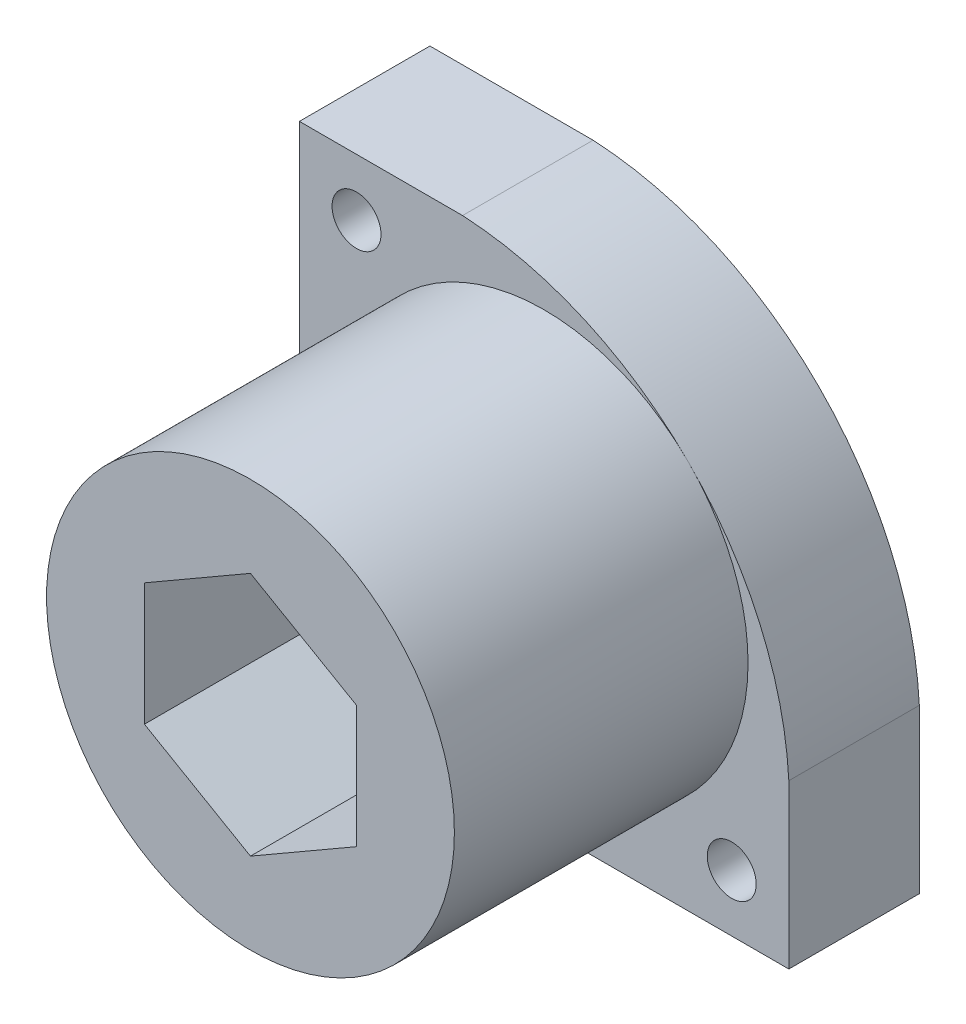
ISO-10303-21;
HEADER;
FILE_DESCRIPTION(('STEP AP214'),'2;1');
FILE_NAME('part.step','',(''),(''),'','','');
FILE_SCHEMA(('AUTOMOTIVE_DESIGN { 1 0 10303 214 1 1 1 1 }'));
ENDSEC;
DATA;
#1=APPLICATION_CONTEXT('core data for automotive mechanical design processes');
#2=APPLICATION_PROTOCOL_DEFINITION('international standard','automotive_design',2000,#1);
#3=PRODUCT_CONTEXT('',#1,'mechanical');
#4=PRODUCT('Part','Part','',(#3));
#5=PRODUCT_RELATED_PRODUCT_CATEGORY('part','',(#4));
#6=PRODUCT_DEFINITION_FORMATION('','',#4);
#7=PRODUCT_DEFINITION_CONTEXT('part definition',#1,'design');
#8=PRODUCT_DEFINITION('design','',#6,#7);
#9=PRODUCT_DEFINITION_SHAPE('','',#8);
#10=(LENGTH_UNIT() NAMED_UNIT(*) SI_UNIT(.MILLI.,.METRE.));
#11=(NAMED_UNIT(*) PLANE_ANGLE_UNIT() SI_UNIT($,.RADIAN.));
#12=(NAMED_UNIT(*) SI_UNIT($,.STERADIAN.) SOLID_ANGLE_UNIT());
#13=UNCERTAINTY_MEASURE_WITH_UNIT(LENGTH_MEASURE(1.E-05),#10,'distance_accuracy_value','');
#14=(GEOMETRIC_REPRESENTATION_CONTEXT(3) GLOBAL_UNCERTAINTY_ASSIGNED_CONTEXT((#13)) GLOBAL_UNIT_ASSIGNED_CONTEXT((#10,
#11,#12)) REPRESENTATION_CONTEXT('',''));
#15=CARTESIAN_POINT('',(0.,0.,0.));
#16=DIRECTION('',(0.,0.,1.));
#17=DIRECTION('',(1.,0.,0.));
#18=AXIS2_PLACEMENT_3D('',#15,#16,#17);
#19=CARTESIAN_POINT('',(0.,0.,8.));
#20=DIRECTION('',(0.,0.,-1.));
#21=DIRECTION('',(-1.,0.,0.));
#22=AXIS2_PLACEMENT_3D('',#19,#20,#21);
#23=PLANE('',#22);
#24=CARTESIAN_POINT('',(26.5,3.5,8.));
#25=DIRECTION('',(0.,0.,1.));
#26=DIRECTION('',(1.,0.,0.));
#27=AXIS2_PLACEMENT_3D('',#24,#25,#26);
#28=CIRCLE('',#27,1.5);
#29=CARTESIAN_POINT('',(28.,3.5,8.));
#30=VERTEX_POINT('',#29);
#31=EDGE_CURVE('E225',#30,#30,#28,.T.);
#32=ORIENTED_EDGE('',*,*,#31,.F.);
#33=EDGE_LOOP('',(#32));
#34=FACE_BOUND('',#33,.T.);
#35=CARTESIAN_POINT('',(3.49999999999999,3.5,8.));
#36=DIRECTION('',(0.,0.,1.));
#37=DIRECTION('',(1.,0.,0.));
#38=AXIS2_PLACEMENT_3D('',#35,#36,#37);
#39=CIRCLE('',#38,1.5);
#40=CARTESIAN_POINT('',(4.99999999999999,3.5,8.));
#41=VERTEX_POINT('',#40);
#42=EDGE_CURVE('E218',#41,#41,#39,.T.);
#43=ORIENTED_EDGE('',*,*,#42,.F.);
#44=EDGE_LOOP('',(#43));
#45=FACE_BOUND('',#44,.T.);
#46=CARTESIAN_POINT('',(3.49999999999999,26.5,8.));
#47=DIRECTION('',(0.,0.,1.));
#48=DIRECTION('',(1.,0.,0.));
#49=AXIS2_PLACEMENT_3D('',#46,#47,#48);
#50=CIRCLE('',#49,1.5);
#51=CARTESIAN_POINT('',(4.99999999999999,26.5,8.));
#52=VERTEX_POINT('',#51);
#53=EDGE_CURVE('E212',#52,#52,#50,.T.);
#54=ORIENTED_EDGE('',*,*,#53,.F.);
#55=EDGE_LOOP('',(#54));
#56=FACE_BOUND('',#55,.T.);
#57=DIRECTION('',(0.,1.,0.));
#58=VECTOR('',#57,1.);
#59=CARTESIAN_POINT('',(30.,0.,8.));
#60=LINE('',#59,#58);
#61=CARTESIAN_POINT('',(30.,0.,8.));
#62=VERTEX_POINT('',#61);
#63=CARTESIAN_POINT('',(30.,10.,8.));
#64=VERTEX_POINT('',#63);
#65=EDGE_CURVE('E131',#62,#64,#60,.T.);
#66=ORIENTED_EDGE('',*,*,#65,.T.);
#67=CARTESIAN_POINT('',(8.89463172139773,8.89463172139773,8.));
#68=DIRECTION('',(0.,0.,-1.));
#69=DIRECTION('',(-1.,0.,0.));
#70=AXIS2_PLACEMENT_3D('',#67,#68,#69);
#71=CIRCLE('',#70,21.1342946228818);
#72=CARTESIAN_POINT('',(23.8388347648318,23.8388347648319,8.));
#73=VERTEX_POINT('',#72);
#74=EDGE_CURVE('E117',#73,#64,#71,.T.);
#75=ORIENTED_EDGE('',*,*,#74,.F.);
#76=CARTESIAN_POINT('',(15.,15.,8.));
#77=DIRECTION('',(0.,0.,-1.));
#78=DIRECTION('',(-1.,0.,0.));
#79=AXIS2_PLACEMENT_3D('',#76,#77,#78);
#80=CIRCLE('',#79,12.5);
#81=EDGE_CURVE('E41',#73,#73,#80,.F.);
#82=ORIENTED_EDGE('',*,*,#81,.F.);
#83=CARTESIAN_POINT('',(9.99999999999999,30.,8.));
#84=VERTEX_POINT('',#83);
#85=EDGE_CURVE('E120',#84,#73,#71,.T.);
#86=ORIENTED_EDGE('',*,*,#85,.F.);
#87=DIRECTION('',(-1.,0.,0.));
#88=VECTOR('',#87,1.);
#89=CARTESIAN_POINT('',(0.,30.,8.));
#90=LINE('',#89,#88);
#91=CARTESIAN_POINT('',(0.,30.,8.));
#92=VERTEX_POINT('',#91);
#93=EDGE_CURVE('E139',#84,#92,#90,.T.);
#94=ORIENTED_EDGE('',*,*,#93,.T.);
#95=DIRECTION('',(0.,-1.,0.));
#96=VECTOR('',#95,1.);
#97=CARTESIAN_POINT('',(0.,0.,8.));
#98=LINE('',#97,#96);
#99=CARTESIAN_POINT('',(0.,0.,8.));
#100=VERTEX_POINT('',#99);
#101=EDGE_CURVE('E143',#92,#100,#98,.T.);
#102=ORIENTED_EDGE('',*,*,#101,.T.);
#103=DIRECTION('',(1.,0.,0.));
#104=VECTOR('',#103,1.);
#105=CARTESIAN_POINT('',(0.,0.,8.));
#106=LINE('',#105,#104);
#107=EDGE_CURVE('E137',#100,#62,#106,.T.);
#108=ORIENTED_EDGE('',*,*,#107,.T.);
#109=EDGE_LOOP('',(#66,#75,#82,#86,#94,#102,#108));
#110=FACE_BOUND('',#109,.T.);
#111=ADVANCED_FACE('F33',(#34,#45,#56,#110),#23,.F.);
#112=CARTESIAN_POINT('',(0.,0.,8.));
#113=DIRECTION('',(1.,0.,0.));
#114=DIRECTION('',(0.,1.,0.));
#115=AXIS2_PLACEMENT_3D('',#112,#113,#114);
#116=PLANE('',#115);
#117=DIRECTION('',(0.,-1.,0.));
#118=VECTOR('',#117,1.);
#119=CARTESIAN_POINT('',(0.,0.,0.));
#120=LINE('',#119,#118);
#121=CARTESIAN_POINT('',(0.,30.,0.));
#122=VERTEX_POINT('',#121);
#123=CARTESIAN_POINT('',(0.,0.,0.));
#124=VERTEX_POINT('',#123);
#125=EDGE_CURVE('E147',#122,#124,#120,.T.);
#126=ORIENTED_EDGE('',*,*,#125,.T.);
#127=DIRECTION('',(0.,0.,-1.));
#128=VECTOR('',#127,1.);
#129=CARTESIAN_POINT('',(0.,0.,8.));
#130=LINE('',#129,#128);
#131=EDGE_CURVE('E160',#100,#124,#130,.T.);
#132=ORIENTED_EDGE('',*,*,#131,.F.);
#133=ORIENTED_EDGE('',*,*,#101,.F.);
#134=DIRECTION('',(0.,0.,-1.));
#135=VECTOR('',#134,1.);
#136=CARTESIAN_POINT('',(0.,30.,8.));
#137=LINE('',#136,#135);
#138=EDGE_CURVE('E141',#92,#122,#137,.T.);
#139=ORIENTED_EDGE('',*,*,#138,.T.);
#140=EDGE_LOOP('',(#126,#132,#133,#139));
#141=FACE_BOUND('',#140,.T.);
#142=ADVANCED_FACE('F35',(#141),#116,.F.);
#143=CARTESIAN_POINT('',(0.,0.,8.));
#144=DIRECTION('',(0.,1.,0.));
#145=DIRECTION('',(0.,0.,1.));
#146=AXIS2_PLACEMENT_3D('',#143,#144,#145);
#147=PLANE('',#146);
#148=DIRECTION('',(1.,0.,0.));
#149=VECTOR('',#148,1.);
#150=CARTESIAN_POINT('',(0.,0.,0.));
#151=LINE('',#150,#149);
#152=CARTESIAN_POINT('',(30.,0.,0.));
#153=VERTEX_POINT('',#152);
#154=EDGE_CURVE('E150',#124,#153,#151,.T.);
#155=ORIENTED_EDGE('',*,*,#154,.T.);
#156=DIRECTION('',(0.,0.,-1.));
#157=VECTOR('',#156,1.);
#158=CARTESIAN_POINT('',(30.,0.,8.));
#159=LINE('',#158,#157);
#160=EDGE_CURVE('E158',#62,#153,#159,.T.);
#161=ORIENTED_EDGE('',*,*,#160,.F.);
#162=ORIENTED_EDGE('',*,*,#107,.F.);
#163=ORIENTED_EDGE('',*,*,#131,.T.);
#164=EDGE_LOOP('',(#155,#161,#162,#163));
#165=FACE_BOUND('',#164,.T.);
#166=ADVANCED_FACE('F253',(#165),#147,.F.);
#167=CARTESIAN_POINT('',(30.,0.,8.));
#168=DIRECTION('',(-1.,0.,0.));
#169=DIRECTION('',(0.,-1.,0.));
#170=AXIS2_PLACEMENT_3D('',#167,#168,#169);
#171=PLANE('',#170);
#172=DIRECTION('',(0.,1.,0.));
#173=VECTOR('',#172,1.);
#174=CARTESIAN_POINT('',(30.,0.,0.));
#175=LINE('',#174,#173);
#176=CARTESIAN_POINT('',(30.,10.,0.));
#177=VERTEX_POINT('',#176);
#178=EDGE_CURVE('E133',#153,#177,#175,.T.);
#179=ORIENTED_EDGE('',*,*,#178,.T.);
#180=DIRECTION('',(0.,0.,1.));
#181=VECTOR('',#180,1.);
#182=CARTESIAN_POINT('',(30.,10.,-2.));
#183=LINE('',#182,#181);
#184=EDGE_CURVE('E47',#177,#64,#183,.T.);
#185=ORIENTED_EDGE('',*,*,#184,.T.);
#186=ORIENTED_EDGE('',*,*,#65,.F.);
#187=ORIENTED_EDGE('',*,*,#160,.T.);
#188=EDGE_LOOP('',(#179,#185,#186,#187));
#189=FACE_BOUND('',#188,.T.);
#190=ADVANCED_FACE('F129',(#189),#171,.F.);
#191=CARTESIAN_POINT('',(0.,30.,8.));
#192=DIRECTION('',(0.,-1.,0.));
#193=DIRECTION('',(0.,0.,-1.));
#194=AXIS2_PLACEMENT_3D('',#191,#192,#193);
#195=PLANE('',#194);
#196=ORIENTED_EDGE('',*,*,#93,.F.);
#197=DIRECTION('',(0.,0.,1.));
#198=VECTOR('',#197,1.);
#199=CARTESIAN_POINT('',(9.99999999999999,30.,-2.));
#200=LINE('',#199,#198);
#201=CARTESIAN_POINT('',(9.99999999999999,30.,0.));
#202=VERTEX_POINT('',#201);
#203=EDGE_CURVE('E134',#202,#84,#200,.T.);
#204=ORIENTED_EDGE('',*,*,#203,.F.);
#205=DIRECTION('',(-1.,0.,0.));
#206=VECTOR('',#205,1.);
#207=CARTESIAN_POINT('',(0.,30.,0.));
#208=LINE('',#207,#206);
#209=EDGE_CURVE('E154',#202,#122,#208,.T.);
#210=ORIENTED_EDGE('',*,*,#209,.T.);
#211=ORIENTED_EDGE('',*,*,#138,.F.);
#212=EDGE_LOOP('',(#196,#204,#210,#211));
#213=FACE_BOUND('',#212,.T.);
#214=ADVANCED_FACE('F169',(#213),#195,.F.);
#215=CARTESIAN_POINT('',(0.,0.,0.));
#216=DIRECTION('',(0.,0.,-1.));
#217=DIRECTION('',(-1.,0.,0.));
#218=AXIS2_PLACEMENT_3D('',#215,#216,#217);
#219=PLANE('',#218);
#220=CARTESIAN_POINT('',(8.89463172139773,8.89463172139773,0.));
#221=DIRECTION('',(0.,0.,-1.));
#222=DIRECTION('',(-1.,0.,0.));
#223=AXIS2_PLACEMENT_3D('',#220,#221,#222);
#224=CIRCLE('',#223,21.1342946228818);
#225=EDGE_CURVE('E11',#177,#202,#224,.F.);
#226=ORIENTED_EDGE('',*,*,#225,.F.);
#227=ORIENTED_EDGE('',*,*,#178,.F.);
#228=ORIENTED_EDGE('',*,*,#154,.F.);
#229=ORIENTED_EDGE('',*,*,#125,.F.);
#230=ORIENTED_EDGE('',*,*,#209,.F.);
#231=EDGE_LOOP('',(#226,#227,#228,#229,#230));
#232=FACE_BOUND('',#231,.T.);
#233=CARTESIAN_POINT('',(26.5,3.5,0.));
#234=DIRECTION('',(0.,0.,1.));
#235=DIRECTION('',(1.,0.,0.));
#236=AXIS2_PLACEMENT_3D('',#233,#234,#235);
#237=CIRCLE('',#236,1.5);
#238=CARTESIAN_POINT('',(28.,3.5,0.));
#239=VERTEX_POINT('',#238);
#240=EDGE_CURVE('E215',#239,#239,#237,.T.);
#241=ORIENTED_EDGE('',*,*,#240,.T.);
#242=EDGE_LOOP('',(#241));
#243=FACE_BOUND('',#242,.T.);
#244=CARTESIAN_POINT('',(3.49999999999999,3.5,0.));
#245=DIRECTION('',(0.,0.,1.));
#246=DIRECTION('',(1.,0.,0.));
#247=AXIS2_PLACEMENT_3D('',#244,#245,#246);
#248=CIRCLE('',#247,1.5);
#249=CARTESIAN_POINT('',(4.99999999999999,3.5,0.));
#250=VERTEX_POINT('',#249);
#251=EDGE_CURVE('E221',#250,#250,#248,.T.);
#252=ORIENTED_EDGE('',*,*,#251,.T.);
#253=EDGE_LOOP('',(#252));
#254=FACE_BOUND('',#253,.T.);
#255=CARTESIAN_POINT('',(3.49999999999999,26.5,0.));
#256=DIRECTION('',(0.,0.,1.));
#257=DIRECTION('',(1.,0.,0.));
#258=AXIS2_PLACEMENT_3D('',#255,#256,#257);
#259=CIRCLE('',#258,1.5);
#260=CARTESIAN_POINT('',(4.99999999999999,26.5,0.));
#261=VERTEX_POINT('',#260);
#262=EDGE_CURVE('E209',#261,#261,#259,.T.);
#263=ORIENTED_EDGE('',*,*,#262,.T.);
#264=EDGE_LOOP('',(#263));
#265=FACE_BOUND('',#264,.T.);
#266=CARTESIAN_POINT('',(15.,15.,0.));
#267=DIRECTION('',(0.,0.,1.));
#268=DIRECTION('',(1.,0.,0.));
#269=AXIS2_PLACEMENT_3D('',#266,#267,#268);
#270=CIRCLE('',#269,5.5);
#271=CARTESIAN_POINT('',(20.5,15.,0.));
#272=VERTEX_POINT('',#271);
#273=EDGE_CURVE('E205',#272,#272,#270,.T.);
#274=ORIENTED_EDGE('',*,*,#273,.T.);
#275=EDGE_LOOP('',(#274));
#276=FACE_BOUND('',#275,.T.);
#277=ADVANCED_FACE('F250',(#232,#243,#254,#265,#276),#219,.T.);
#278=CARTESIAN_POINT('',(15.,15.,16.));
#279=DIRECTION('',(0.,0.,-1.));
#280=DIRECTION('',(-1.,0.,0.));
#281=AXIS2_PLACEMENT_3D('',#278,#279,#280);
#282=CYLINDRICAL_SURFACE('',#281,12.5);
#283=ORIENTED_EDGE('',*,*,#81,.T.);
#284=EDGE_LOOP('',(#283));
#285=FACE_BOUND('',#284,.T.);
#286=CARTESIAN_POINT('',(15.,15.,26.));
#287=DIRECTION('',(0.,0.,1.));
#288=DIRECTION('',(1.,0.,0.));
#289=AXIS2_PLACEMENT_3D('',#286,#287,#288);
#290=CIRCLE('',#289,12.5);
#291=CARTESIAN_POINT('',(27.5,15.,26.));
#292=VERTEX_POINT('',#291);
#293=EDGE_CURVE('E222',#292,#292,#290,.T.);
#294=ORIENTED_EDGE('',*,*,#293,.F.);
#295=EDGE_LOOP('',(#294));
#296=FACE_BOUND('',#295,.T.);
#297=ADVANCED_FACE('F163',(#285,#296),#282,.T.);
#298=CARTESIAN_POINT('',(21.5,18.7527767497326,16.));
#299=DIRECTION('',(-0.5,-0.866025403784439,0.));
#300=DIRECTION('',(0.866025403784439,-0.5,0.));
#301=AXIS2_PLACEMENT_3D('',#298,#299,#300);
#302=PLANE('',#301);
#303=DIRECTION('',(-0.866025403784438,0.5,0.));
#304=VECTOR('',#303,1.);
#305=CARTESIAN_POINT('',(21.5,18.7527767497326,8.));
#306=LINE('',#305,#304);
#307=CARTESIAN_POINT('',(21.5,18.7527767497326,8.));
#308=VERTEX_POINT('',#307);
#309=CARTESIAN_POINT('',(15.,22.5055534994651,8.));
#310=VERTEX_POINT('',#309);
#311=EDGE_CURVE('E202',#308,#310,#306,.T.);
#312=ORIENTED_EDGE('',*,*,#311,.F.);
#313=DIRECTION('',(0.,0.,-1.));
#314=VECTOR('',#313,1.);
#315=CARTESIAN_POINT('',(21.5,18.7527767497326,16.));
#316=LINE('',#315,#314);
#317=CARTESIAN_POINT('',(21.5,18.7527767497326,26.));
#318=VERTEX_POINT('',#317);
#319=EDGE_CURVE('E55',#318,#308,#316,.T.);
#320=ORIENTED_EDGE('',*,*,#319,.F.);
#321=DIRECTION('',(-0.866025403784438,0.5,0.));
#322=VECTOR('',#321,1.);
#323=CARTESIAN_POINT('',(21.5,18.7527767497326,26.));
#324=LINE('',#323,#322);
#325=CARTESIAN_POINT('',(15.,22.5055534994651,26.));
#326=VERTEX_POINT('',#325);
#327=EDGE_CURVE('E246',#318,#326,#324,.T.);
#328=ORIENTED_EDGE('',*,*,#327,.T.);
#329=DIRECTION('',(0.,0.,-1.));
#330=VECTOR('',#329,1.);
#331=CARTESIAN_POINT('',(15.,22.5055534994651,16.));
#332=LINE('',#331,#330);
#333=EDGE_CURVE('E151',#326,#310,#332,.T.);
#334=ORIENTED_EDGE('',*,*,#333,.T.);
#335=EDGE_LOOP('',(#312,#320,#328,#334));
#336=FACE_BOUND('',#335,.T.);
#337=ADVANCED_FACE('F298',(#336),#302,.T.);
#338=CARTESIAN_POINT('',(15.,22.5055534994651,16.));
#339=DIRECTION('',(0.5,-0.866025403784439,0.));
#340=DIRECTION('',(0.866025403784439,0.5,0.));
#341=AXIS2_PLACEMENT_3D('',#338,#339,#340);
#342=PLANE('',#341);
#343=DIRECTION('',(-0.866025403784438,-0.5,0.));
#344=VECTOR('',#343,1.);
#345=CARTESIAN_POINT('',(15.,22.5055534994651,8.));
#346=LINE('',#345,#344);
#347=CARTESIAN_POINT('',(8.49999999999999,18.7527767497326,8.));
#348=VERTEX_POINT('',#347);
#349=EDGE_CURVE('E199',#310,#348,#346,.T.);
#350=ORIENTED_EDGE('',*,*,#349,.F.);
#351=ORIENTED_EDGE('',*,*,#333,.F.);
#352=DIRECTION('',(-0.866025403784439,-0.5,0.));
#353=VECTOR('',#352,1.);
#354=CARTESIAN_POINT('',(15.,22.5055534994651,26.));
#355=LINE('',#354,#353);
#356=CARTESIAN_POINT('',(8.49999999999999,18.7527767497326,26.));
#357=VERTEX_POINT('',#356);
#358=EDGE_CURVE('E243',#326,#357,#355,.T.);
#359=ORIENTED_EDGE('',*,*,#358,.T.);
#360=DIRECTION('',(0.,0.,-1.));
#361=VECTOR('',#360,1.);
#362=CARTESIAN_POINT('',(8.49999999999999,18.7527767497326,16.));
#363=LINE('',#362,#361);
#364=EDGE_CURVE('E178',#357,#348,#363,.T.);
#365=ORIENTED_EDGE('',*,*,#364,.T.);
#366=EDGE_LOOP('',(#350,#351,#359,#365));
#367=FACE_BOUND('',#366,.T.);
#368=ADVANCED_FACE('F300',(#367),#342,.T.);
#369=CARTESIAN_POINT('',(8.49999999999999,18.7527767497326,16.));
#370=DIRECTION('',(1.,0.,0.));
#371=DIRECTION('',(0.,0.,-1.));
#372=AXIS2_PLACEMENT_3D('',#369,#370,#371);
#373=PLANE('',#372);
#374=DIRECTION('',(0.,-1.,0.));
#375=VECTOR('',#374,1.);
#376=CARTESIAN_POINT('',(8.49999999999999,18.7527767497326,8.));
#377=LINE('',#376,#375);
#378=CARTESIAN_POINT('',(8.49999999999999,11.2472232502674,8.));
#379=VERTEX_POINT('',#378);
#380=EDGE_CURVE('E196',#348,#379,#377,.T.);
#381=ORIENTED_EDGE('',*,*,#380,.F.);
#382=ORIENTED_EDGE('',*,*,#364,.F.);
#383=DIRECTION('',(0.,-1.,0.));
#384=VECTOR('',#383,1.);
#385=CARTESIAN_POINT('',(8.49999999999999,18.7527767497326,26.));
#386=LINE('',#385,#384);
#387=CARTESIAN_POINT('',(8.49999999999999,11.2472232502674,26.));
#388=VERTEX_POINT('',#387);
#389=EDGE_CURVE('E240',#357,#388,#386,.T.);
#390=ORIENTED_EDGE('',*,*,#389,.T.);
#391=DIRECTION('',(0.,0.,-1.));
#392=VECTOR('',#391,1.);
#393=CARTESIAN_POINT('',(8.49999999999999,11.2472232502674,16.));
#394=LINE('',#393,#392);
#395=EDGE_CURVE('E180',#388,#379,#394,.T.);
#396=ORIENTED_EDGE('',*,*,#395,.T.);
#397=EDGE_LOOP('',(#381,#382,#390,#396));
#398=FACE_BOUND('',#397,.T.);
#399=ADVANCED_FACE('F304',(#398),#373,.T.);
#400=CARTESIAN_POINT('',(8.49999999999999,11.2472232502674,16.));
#401=DIRECTION('',(0.5,0.866025403784439,0.));
#402=DIRECTION('',(-0.866025403784439,0.5,0.));
#403=AXIS2_PLACEMENT_3D('',#400,#401,#402);
#404=PLANE('',#403);
#405=DIRECTION('',(0.866025403784439,-0.5,0.));
#406=VECTOR('',#405,1.);
#407=CARTESIAN_POINT('',(8.49999999999999,11.2472232502674,8.));
#408=LINE('',#407,#406);
#409=CARTESIAN_POINT('',(15.,7.49444650053486,8.));
#410=VERTEX_POINT('',#409);
#411=EDGE_CURVE('E193',#379,#410,#408,.T.);
#412=ORIENTED_EDGE('',*,*,#411,.F.);
#413=ORIENTED_EDGE('',*,*,#395,.F.);
#414=DIRECTION('',(0.866025403784439,-0.5,0.));
#415=VECTOR('',#414,1.);
#416=CARTESIAN_POINT('',(8.49999999999999,11.2472232502674,26.));
#417=LINE('',#416,#415);
#418=CARTESIAN_POINT('',(15.,7.49444650053486,26.));
#419=VERTEX_POINT('',#418);
#420=EDGE_CURVE('E237',#388,#419,#417,.T.);
#421=ORIENTED_EDGE('',*,*,#420,.T.);
#422=DIRECTION('',(0.,0.,-1.));
#423=VECTOR('',#422,1.);
#424=CARTESIAN_POINT('',(15.,7.49444650053486,16.));
#425=LINE('',#424,#423);
#426=EDGE_CURVE('E182',#419,#410,#425,.T.);
#427=ORIENTED_EDGE('',*,*,#426,.T.);
#428=EDGE_LOOP('',(#412,#413,#421,#427));
#429=FACE_BOUND('',#428,.T.);
#430=ADVANCED_FACE('F306',(#429),#404,.T.);
#431=CARTESIAN_POINT('',(15.,7.49444650053486,16.));
#432=DIRECTION('',(-0.5,0.866025403784439,0.));
#433=DIRECTION('',(-0.866025403784439,-0.5,0.));
#434=AXIS2_PLACEMENT_3D('',#431,#432,#433);
#435=PLANE('',#434);
#436=DIRECTION('',(0.866025403784439,0.5,0.));
#437=VECTOR('',#436,1.);
#438=CARTESIAN_POINT('',(15.,7.49444650053486,8.));
#439=LINE('',#438,#437);
#440=CARTESIAN_POINT('',(21.5,11.2472232502674,8.));
#441=VERTEX_POINT('',#440);
#442=EDGE_CURVE('E190',#410,#441,#439,.T.);
#443=ORIENTED_EDGE('',*,*,#442,.F.);
#444=ORIENTED_EDGE('',*,*,#426,.F.);
#445=DIRECTION('',(0.866025403784439,0.5,0.));
#446=VECTOR('',#445,1.);
#447=CARTESIAN_POINT('',(15.,7.49444650053486,26.));
#448=LINE('',#447,#446);
#449=CARTESIAN_POINT('',(21.5,11.2472232502674,26.));
#450=VERTEX_POINT('',#449);
#451=EDGE_CURVE('E234',#419,#450,#448,.T.);
#452=ORIENTED_EDGE('',*,*,#451,.T.);
#453=DIRECTION('',(0.,0.,-1.));
#454=VECTOR('',#453,1.);
#455=CARTESIAN_POINT('',(21.5,11.2472232502674,16.));
#456=LINE('',#455,#454);
#457=EDGE_CURVE('E184',#450,#441,#456,.T.);
#458=ORIENTED_EDGE('',*,*,#457,.T.);
#459=EDGE_LOOP('',(#443,#444,#452,#458));
#460=FACE_BOUND('',#459,.T.);
#461=ADVANCED_FACE('F283',(#460),#435,.T.);
#462=CARTESIAN_POINT('',(21.5,11.2472232502674,16.));
#463=DIRECTION('',(-1.,0.,0.));
#464=DIRECTION('',(0.,0.,1.));
#465=AXIS2_PLACEMENT_3D('',#462,#463,#464);
#466=PLANE('',#465);
#467=DIRECTION('',(0.,1.,0.));
#468=VECTOR('',#467,1.);
#469=CARTESIAN_POINT('',(21.5,11.2472232502674,8.));
#470=LINE('',#469,#468);
#471=EDGE_CURVE('E187',#441,#308,#470,.T.);
#472=ORIENTED_EDGE('',*,*,#471,.F.);
#473=ORIENTED_EDGE('',*,*,#457,.F.);
#474=DIRECTION('',(0.,1.,0.));
#475=VECTOR('',#474,1.);
#476=CARTESIAN_POINT('',(21.5,11.2472232502674,26.));
#477=LINE('',#476,#475);
#478=EDGE_CURVE('E232',#450,#318,#477,.T.);
#479=ORIENTED_EDGE('',*,*,#478,.T.);
#480=ORIENTED_EDGE('',*,*,#319,.T.);
#481=EDGE_LOOP('',(#472,#473,#479,#480));
#482=FACE_BOUND('',#481,.T.);
#483=ADVANCED_FACE('F274',(#482),#466,.T.);
#484=CARTESIAN_POINT('',(15.,15.,8.));
#485=DIRECTION('',(0.,0.,1.));
#486=DIRECTION('',(1.,0.,0.));
#487=AXIS2_PLACEMENT_3D('',#484,#485,#486);
#488=CIRCLE('',#487,5.5);
#489=CARTESIAN_POINT('',(20.5,15.,8.));
#490=VERTEX_POINT('',#489);
#491=EDGE_CURVE('E206',#490,#490,#488,.T.);
#492=ORIENTED_EDGE('',*,*,#491,.F.);
#493=EDGE_LOOP('',(#492));
#494=FACE_BOUND('',#493,.T.);
#495=ORIENTED_EDGE('',*,*,#471,.T.);
#496=ORIENTED_EDGE('',*,*,#311,.T.);
#497=ORIENTED_EDGE('',*,*,#349,.T.);
#498=ORIENTED_EDGE('',*,*,#380,.T.);
#499=ORIENTED_EDGE('',*,*,#411,.T.);
#500=ORIENTED_EDGE('',*,*,#442,.T.);
#501=EDGE_LOOP('',(#495,#496,#497,#498,#499,#500));
#502=FACE_BOUND('',#501,.T.);
#503=ADVANCED_FACE('F264',(#494,#502),#23,.F.);
#504=CARTESIAN_POINT('',(15.,15.,0.));
#505=DIRECTION('',(0.,0.,1.));
#506=DIRECTION('',(1.,0.,0.));
#507=AXIS2_PLACEMENT_3D('',#504,#505,#506);
#508=CYLINDRICAL_SURFACE('',#507,5.5);
#509=ORIENTED_EDGE('',*,*,#273,.F.);
#510=EDGE_LOOP('',(#509));
#511=FACE_BOUND('',#510,.T.);
#512=ORIENTED_EDGE('',*,*,#491,.T.);
#513=EDGE_LOOP('',(#512));
#514=FACE_BOUND('',#513,.T.);
#515=ADVANCED_FACE('F273',(#511,#514),#508,.F.);
#516=CARTESIAN_POINT('',(3.49999999999999,26.5,0.));
#517=DIRECTION('',(0.,0.,1.));
#518=DIRECTION('',(1.,0.,0.));
#519=AXIS2_PLACEMENT_3D('',#516,#517,#518);
#520=CYLINDRICAL_SURFACE('',#519,1.5);
#521=ORIENTED_EDGE('',*,*,#262,.F.);
#522=EDGE_LOOP('',(#521));
#523=FACE_BOUND('',#522,.T.);
#524=ORIENTED_EDGE('',*,*,#53,.T.);
#525=EDGE_LOOP('',(#524));
#526=FACE_BOUND('',#525,.T.);
#527=ADVANCED_FACE('F280',(#523,#526),#520,.F.);
#528=CARTESIAN_POINT('',(3.49999999999999,3.5,0.));
#529=DIRECTION('',(0.,0.,1.));
#530=DIRECTION('',(1.,0.,0.));
#531=AXIS2_PLACEMENT_3D('',#528,#529,#530);
#532=CYLINDRICAL_SURFACE('',#531,1.5);
#533=ORIENTED_EDGE('',*,*,#251,.F.);
#534=EDGE_LOOP('',(#533));
#535=FACE_BOUND('',#534,.T.);
#536=ORIENTED_EDGE('',*,*,#42,.T.);
#537=EDGE_LOOP('',(#536));
#538=FACE_BOUND('',#537,.T.);
#539=ADVANCED_FACE('F415',(#535,#538),#532,.F.);
#540=CARTESIAN_POINT('',(26.5,3.5,0.));
#541=DIRECTION('',(0.,0.,1.));
#542=DIRECTION('',(1.,0.,0.));
#543=AXIS2_PLACEMENT_3D('',#540,#541,#542);
#544=CYLINDRICAL_SURFACE('',#543,1.5);
#545=ORIENTED_EDGE('',*,*,#240,.F.);
#546=EDGE_LOOP('',(#545));
#547=FACE_BOUND('',#546,.T.);
#548=ORIENTED_EDGE('',*,*,#31,.T.);
#549=EDGE_LOOP('',(#548));
#550=FACE_BOUND('',#549,.T.);
#551=ADVANCED_FACE('F423',(#547,#550),#544,.F.);
#552=CARTESIAN_POINT('',(15.,15.,26.));
#553=DIRECTION('',(0.,0.,1.));
#554=DIRECTION('',(1.,0.,0.));
#555=AXIS2_PLACEMENT_3D('',#552,#553,#554);
#556=PLANE('',#555);
#557=ORIENTED_EDGE('',*,*,#293,.T.);
#558=EDGE_LOOP('',(#557));
#559=FACE_BOUND('',#558,.T.);
#560=ORIENTED_EDGE('',*,*,#358,.F.);
#561=ORIENTED_EDGE('',*,*,#327,.F.);
#562=ORIENTED_EDGE('',*,*,#478,.F.);
#563=ORIENTED_EDGE('',*,*,#451,.F.);
#564=ORIENTED_EDGE('',*,*,#420,.F.);
#565=ORIENTED_EDGE('',*,*,#389,.F.);
#566=EDGE_LOOP('',(#560,#561,#562,#563,#564,#565));
#567=FACE_BOUND('',#566,.T.);
#568=ADVANCED_FACE('F295',(#559,#567),#556,.T.);
#569=CARTESIAN_POINT('',(8.89463172139773,8.89463172139773,-2.));
#570=DIRECTION('',(0.,0.,1.));
#571=DIRECTION('',(1.,0.,0.));
#572=AXIS2_PLACEMENT_3D('',#569,#570,#571);
#573=CYLINDRICAL_SURFACE('',#572,21.1342946228818);
#574=ORIENTED_EDGE('',*,*,#225,.T.);
#575=ORIENTED_EDGE('',*,*,#203,.T.);
#576=ORIENTED_EDGE('',*,*,#85,.T.);
#577=ORIENTED_EDGE('',*,*,#74,.T.);
#578=ORIENTED_EDGE('',*,*,#184,.F.);
#579=EDGE_LOOP('',(#574,#575,#576,#577,#578));
#580=FACE_BOUND('',#579,.T.);
#581=ADVANCED_FACE('F118',(#580),#573,.T.);
#582=CLOSED_SHELL('',(#111,#142,#166,#190,#214,#277,#297,#337,#368,#399,#430,#461,#483,#503,
#515,#527,#539,#551,#568,#581));
#583=MANIFOLD_SOLID_BREP('B2',#582);
#584=ADVANCED_BREP_SHAPE_REPRESENTATION('',(#18,#583),#14);
#585=SHAPE_DEFINITION_REPRESENTATION(#9,#584);
ENDSEC;
END-ISO-10303-21;
